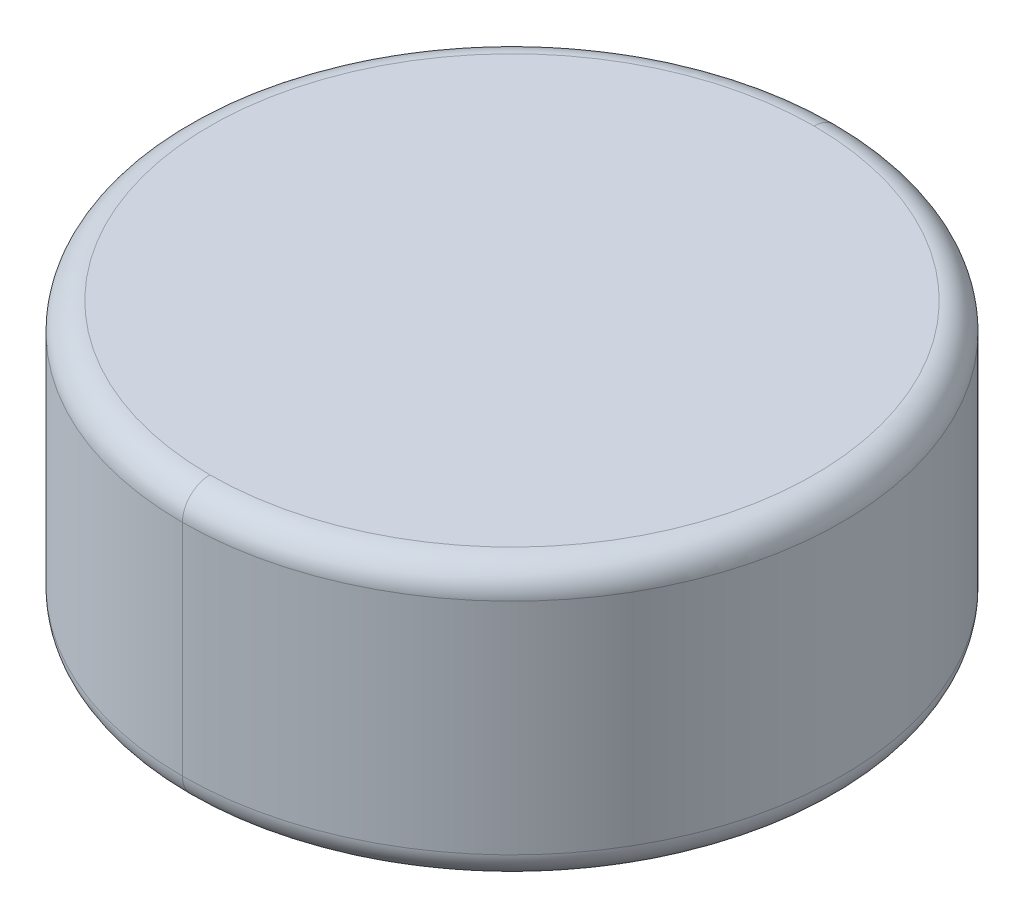
ISO-10303-21;
HEADER;
FILE_DESCRIPTION(('STEP AP214'),'2;1');
FILE_NAME('part.step','',(''),(''),'','','');
FILE_SCHEMA(('AUTOMOTIVE_DESIGN { 1 0 10303 214 1 1 1 1 }'));
ENDSEC;
DATA;
#1=APPLICATION_CONTEXT('core data for automotive mechanical design processes');
#2=APPLICATION_PROTOCOL_DEFINITION('international standard','automotive_design',2000,#1);
#3=PRODUCT_CONTEXT('',#1,'mechanical');
#4=PRODUCT('Part','Part','',(#3));
#5=PRODUCT_RELATED_PRODUCT_CATEGORY('part','',(#4));
#6=PRODUCT_DEFINITION_FORMATION('','',#4);
#7=PRODUCT_DEFINITION_CONTEXT('part definition',#1,'design');
#8=PRODUCT_DEFINITION('design','',#6,#7);
#9=PRODUCT_DEFINITION_SHAPE('','',#8);
#10=(LENGTH_UNIT() NAMED_UNIT(*) SI_UNIT(.MILLI.,.METRE.));
#11=(NAMED_UNIT(*) PLANE_ANGLE_UNIT() SI_UNIT($,.RADIAN.));
#12=(NAMED_UNIT(*) SI_UNIT($,.STERADIAN.) SOLID_ANGLE_UNIT());
#13=UNCERTAINTY_MEASURE_WITH_UNIT(LENGTH_MEASURE(1.E-05),#10,'distance_accuracy_value','');
#14=(GEOMETRIC_REPRESENTATION_CONTEXT(3) GLOBAL_UNCERTAINTY_ASSIGNED_CONTEXT((#13)) GLOBAL_UNIT_ASSIGNED_CONTEXT((#10,
#11,#12)) REPRESENTATION_CONTEXT('',''));
#15=CARTESIAN_POINT('',(0.,0.,0.));
#16=DIRECTION('',(0.,0.,1.));
#17=DIRECTION('',(1.,0.,0.));
#18=AXIS2_PLACEMENT_3D('',#15,#16,#17);
#19=CARTESIAN_POINT('',(0.,2.25,0.));
#20=DIRECTION('',(0.,1.,0.));
#21=DIRECTION('',(0.,0.,1.));
#22=AXIS2_PLACEMENT_3D('',#19,#20,#21);
#23=TOROIDAL_SURFACE('',#22,2.75,0.25);
#24=CARTESIAN_POINT('',(0.,2.25,-2.75));
#25=DIRECTION('',(1.,0.,0.));
#26=DIRECTION('',(0.,0.,-1.));
#27=AXIS2_PLACEMENT_3D('',#24,#25,#26);
#28=CIRCLE('',#27,0.25);
#29=CARTESIAN_POINT('',(0.,2.25,-3.));
#30=VERTEX_POINT('',#29);
#31=CARTESIAN_POINT('',(0.,2.5,-2.75));
#32=VERTEX_POINT('',#31);
#33=EDGE_CURVE('E99',#30,#32,#28,.T.);
#34=ORIENTED_EDGE('',*,*,#33,.F.);
#35=CARTESIAN_POINT('',(0.,2.25,0.));
#36=DIRECTION('',(0.,-1.,0.));
#37=DIRECTION('',(0.,0.,1.));
#38=AXIS2_PLACEMENT_3D('',#35,#36,#37);
#39=CIRCLE('',#38,3.);
#40=CARTESIAN_POINT('',(0.,2.25,3.));
#41=VERTEX_POINT('',#40);
#42=EDGE_CURVE('E21',#41,#30,#39,.T.);
#43=ORIENTED_EDGE('',*,*,#42,.F.);
#44=CARTESIAN_POINT('',(0.,2.25,2.75));
#45=DIRECTION('',(-1.,0.,0.));
#46=DIRECTION('',(0.,0.,1.));
#47=AXIS2_PLACEMENT_3D('',#44,#45,#46);
#48=CIRCLE('',#47,0.25);
#49=CARTESIAN_POINT('',(0.,2.5,2.75));
#50=VERTEX_POINT('',#49);
#51=EDGE_CURVE('E91',#41,#50,#48,.T.);
#52=ORIENTED_EDGE('',*,*,#51,.T.);
#53=CARTESIAN_POINT('',(0.,2.5,0.));
#54=DIRECTION('',(0.,1.,0.));
#55=DIRECTION('',(0.,0.,1.));
#56=AXIS2_PLACEMENT_3D('',#53,#54,#55);
#57=CIRCLE('',#56,2.75);
#58=EDGE_CURVE('E28',#32,#50,#57,.T.);
#59=ORIENTED_EDGE('',*,*,#58,.F.);
#60=EDGE_LOOP('',(#34,#43,#52,#59));
#61=FACE_BOUND('',#60,.T.);
#62=ADVANCED_FACE('F17',(#61),#23,.T.);
#63=CARTESIAN_POINT('',(0.,0.25,0.));
#64=DIRECTION('',(0.,1.,0.));
#65=DIRECTION('',(0.,0.,1.));
#66=AXIS2_PLACEMENT_3D('',#63,#64,#65);
#67=TOROIDAL_SURFACE('',#66,2.75,0.25);
#68=CARTESIAN_POINT('',(0.,0.25,-2.75));
#69=DIRECTION('',(1.,0.,0.));
#70=DIRECTION('',(0.,0.,-1.));
#71=AXIS2_PLACEMENT_3D('',#68,#69,#70);
#72=CIRCLE('',#71,0.25);
#73=CARTESIAN_POINT('',(0.,0.,-2.75));
#74=VERTEX_POINT('',#73);
#75=CARTESIAN_POINT('',(0.,0.25,-3.));
#76=VERTEX_POINT('',#75);
#77=EDGE_CURVE('E116',#74,#76,#72,.T.);
#78=ORIENTED_EDGE('',*,*,#77,.F.);
#79=CARTESIAN_POINT('',(0.,0.,0.));
#80=DIRECTION('',(0.,-1.,0.));
#81=DIRECTION('',(0.,0.,1.));
#82=AXIS2_PLACEMENT_3D('',#79,#80,#81);
#83=CIRCLE('',#82,2.75);
#84=CARTESIAN_POINT('',(0.,0.,2.75));
#85=VERTEX_POINT('',#84);
#86=EDGE_CURVE('E11',#85,#74,#83,.T.);
#87=ORIENTED_EDGE('',*,*,#86,.F.);
#88=CARTESIAN_POINT('',(0.,0.25,2.75));
#89=DIRECTION('',(-1.,0.,0.));
#90=DIRECTION('',(0.,0.,1.));
#91=AXIS2_PLACEMENT_3D('',#88,#89,#90);
#92=CIRCLE('',#91,0.25);
#93=CARTESIAN_POINT('',(0.,0.25,3.));
#94=VERTEX_POINT('',#93);
#95=EDGE_CURVE('E115',#85,#94,#92,.T.);
#96=ORIENTED_EDGE('',*,*,#95,.T.);
#97=CARTESIAN_POINT('',(0.,0.25,0.));
#98=DIRECTION('',(0.,1.,0.));
#99=DIRECTION('',(0.,0.,1.));
#100=AXIS2_PLACEMENT_3D('',#97,#98,#99);
#101=CIRCLE('',#100,3.);
#102=EDGE_CURVE('E43',#76,#94,#101,.T.);
#103=ORIENTED_EDGE('',*,*,#102,.F.);
#104=EDGE_LOOP('',(#78,#87,#96,#103));
#105=FACE_BOUND('',#104,.T.);
#106=ADVANCED_FACE('F147',(#105),#67,.T.);
#107=CARTESIAN_POINT('',(0.,0.,0.));
#108=DIRECTION('',(0.,1.,0.));
#109=DIRECTION('',(0.,0.,-1.));
#110=AXIS2_PLACEMENT_3D('',#107,#108,#109);
#111=PLANE('',#110);
#112=ORIENTED_EDGE('',*,*,#86,.T.);
#113=CARTESIAN_POINT('',(0.,0.,0.));
#114=DIRECTION('',(0.,-1.,0.));
#115=DIRECTION('',(0.,0.,1.));
#116=AXIS2_PLACEMENT_3D('',#113,#114,#115);
#117=CIRCLE('',#116,2.75);
#118=EDGE_CURVE('E96',#74,#85,#117,.T.);
#119=ORIENTED_EDGE('',*,*,#118,.T.);
#120=EDGE_LOOP('',(#112,#119));
#121=FACE_BOUND('',#120,.T.);
#122=ADVANCED_FACE('F19',(#121),#111,.F.);
#123=CARTESIAN_POINT('',(0.,2.5,0.));
#124=DIRECTION('',(0.,1.,0.));
#125=DIRECTION('',(0.,0.,-1.));
#126=AXIS2_PLACEMENT_3D('',#123,#124,#125);
#127=PLANE('',#126);
#128=CARTESIAN_POINT('',(0.,2.5,0.));
#129=DIRECTION('',(0.,1.,0.));
#130=DIRECTION('',(0.,0.,1.));
#131=AXIS2_PLACEMENT_3D('',#128,#129,#130);
#132=CIRCLE('',#131,2.75);
#133=EDGE_CURVE('E86',#50,#32,#132,.T.);
#134=ORIENTED_EDGE('',*,*,#133,.T.);
#135=ORIENTED_EDGE('',*,*,#58,.T.);
#136=EDGE_LOOP('',(#134,#135));
#137=FACE_BOUND('',#136,.T.);
#138=ADVANCED_FACE('F84',(#137),#127,.T.);
#139=CARTESIAN_POINT('',(0.,2.5,0.));
#140=DIRECTION('',(0.,-1.,0.));
#141=DIRECTION('',(0.,0.,-1.));
#142=AXIS2_PLACEMENT_3D('',#139,#140,#141);
#143=CYLINDRICAL_SURFACE('',#142,3.);
#144=DIRECTION('',(0.,-1.,0.));
#145=VECTOR('',#144,1.);
#146=CARTESIAN_POINT('',(0.,2.5,3.));
#147=LINE('',#146,#145);
#148=EDGE_CURVE('E117',#41,#94,#147,.T.);
#149=ORIENTED_EDGE('',*,*,#148,.F.);
#150=ORIENTED_EDGE('',*,*,#42,.T.);
#151=DIRECTION('',(0.,-1.,0.));
#152=VECTOR('',#151,1.);
#153=CARTESIAN_POINT('',(0.,2.5,-3.));
#154=LINE('',#153,#152);
#155=EDGE_CURVE('E120',#30,#76,#154,.T.);
#156=ORIENTED_EDGE('',*,*,#155,.T.);
#157=ORIENTED_EDGE('',*,*,#102,.T.);
#158=EDGE_LOOP('',(#149,#150,#156,#157));
#159=FACE_BOUND('',#158,.T.);
#160=ADVANCED_FACE('F157',(#159),#143,.T.);
#161=CARTESIAN_POINT('',(0.,2.5,0.));
#162=DIRECTION('',(0.,-1.,0.));
#163=DIRECTION('',(0.,0.,-1.));
#164=AXIS2_PLACEMENT_3D('',#161,#162,#163);
#165=CYLINDRICAL_SURFACE('',#164,3.);
#166=CARTESIAN_POINT('',(0.,2.25,0.));
#167=DIRECTION('',(0.,-1.,0.));
#168=DIRECTION('',(0.,0.,1.));
#169=AXIS2_PLACEMENT_3D('',#166,#167,#168);
#170=CIRCLE('',#169,3.);
#171=EDGE_CURVE('E107',#30,#41,#170,.T.);
#172=ORIENTED_EDGE('',*,*,#171,.T.);
#173=ORIENTED_EDGE('',*,*,#148,.T.);
#174=CARTESIAN_POINT('',(0.,0.25,0.));
#175=DIRECTION('',(0.,1.,0.));
#176=DIRECTION('',(0.,0.,1.));
#177=AXIS2_PLACEMENT_3D('',#174,#175,#176);
#178=CIRCLE('',#177,3.);
#179=EDGE_CURVE('E112',#94,#76,#178,.T.);
#180=ORIENTED_EDGE('',*,*,#179,.T.);
#181=ORIENTED_EDGE('',*,*,#155,.F.);
#182=EDGE_LOOP('',(#172,#173,#180,#181));
#183=FACE_BOUND('',#182,.T.);
#184=ADVANCED_FACE('F130',(#183),#165,.T.);
#185=CARTESIAN_POINT('',(0.,0.25,0.));
#186=DIRECTION('',(0.,1.,0.));
#187=DIRECTION('',(0.,0.,1.));
#188=AXIS2_PLACEMENT_3D('',#185,#186,#187);
#189=TOROIDAL_SURFACE('',#188,2.75,0.25);
#190=ORIENTED_EDGE('',*,*,#118,.F.);
#191=ORIENTED_EDGE('',*,*,#77,.T.);
#192=ORIENTED_EDGE('',*,*,#179,.F.);
#193=ORIENTED_EDGE('',*,*,#95,.F.);
#194=EDGE_LOOP('',(#190,#191,#192,#193));
#195=FACE_BOUND('',#194,.T.);
#196=ADVANCED_FACE('F145',(#195),#189,.T.);
#197=CARTESIAN_POINT('',(0.,2.25,0.));
#198=DIRECTION('',(0.,1.,0.));
#199=DIRECTION('',(0.,0.,1.));
#200=AXIS2_PLACEMENT_3D('',#197,#198,#199);
#201=TOROIDAL_SURFACE('',#200,2.75,0.25);
#202=ORIENTED_EDGE('',*,*,#171,.F.);
#203=ORIENTED_EDGE('',*,*,#33,.T.);
#204=ORIENTED_EDGE('',*,*,#133,.F.);
#205=ORIENTED_EDGE('',*,*,#51,.F.);
#206=EDGE_LOOP('',(#202,#203,#204,#205));
#207=FACE_BOUND('',#206,.T.);
#208=ADVANCED_FACE('F98',(#207),#201,.T.);
#209=CLOSED_SHELL('',(#62,#106,#122,#138,#160,#184,#196,#208));
#210=MANIFOLD_SOLID_BREP('B1',#209);
#211=ADVANCED_BREP_SHAPE_REPRESENTATION('',(#18,#210),#14);
#212=SHAPE_DEFINITION_REPRESENTATION(#9,#211);
ENDSEC;
END-ISO-10303-21;
